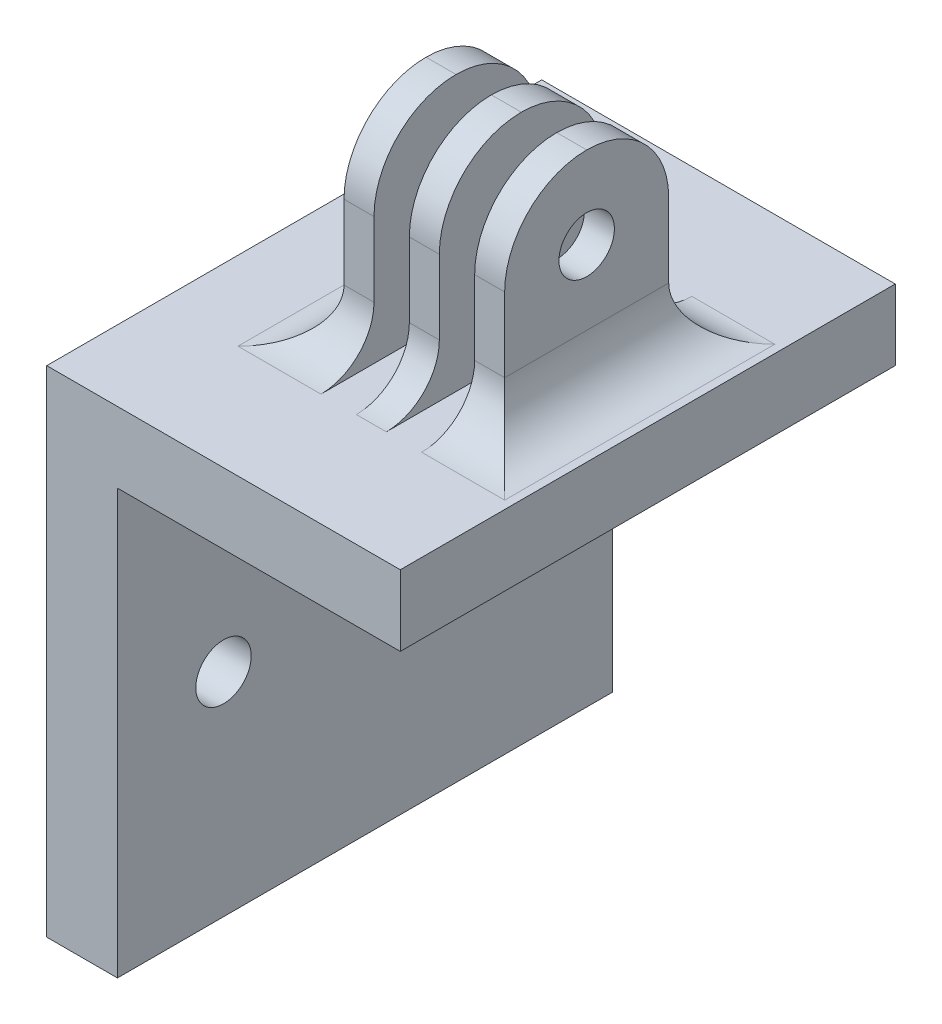
ISO-10303-21;
HEADER;
FILE_DESCRIPTION(('STEP AP214'),'2;1');
FILE_NAME('part.step','',(''),(''),'','','');
FILE_SCHEMA(('AUTOMOTIVE_DESIGN { 1 0 10303 214 1 1 1 1 }'));
ENDSEC;
DATA;
#1=APPLICATION_CONTEXT('core data for automotive mechanical design processes');
#2=APPLICATION_PROTOCOL_DEFINITION('international standard','automotive_design',2000,#1);
#3=PRODUCT_CONTEXT('',#1,'mechanical');
#4=PRODUCT('Part','Part','',(#3));
#5=PRODUCT_RELATED_PRODUCT_CATEGORY('part','',(#4));
#6=PRODUCT_DEFINITION_FORMATION('','',#4);
#7=PRODUCT_DEFINITION_CONTEXT('part definition',#1,'design');
#8=PRODUCT_DEFINITION('design','',#6,#7);
#9=PRODUCT_DEFINITION_SHAPE('','',#8);
#10=(LENGTH_UNIT() NAMED_UNIT(*) SI_UNIT(.MILLI.,.METRE.));
#11=(NAMED_UNIT(*) PLANE_ANGLE_UNIT() SI_UNIT($,.RADIAN.));
#12=(NAMED_UNIT(*) SI_UNIT($,.STERADIAN.) SOLID_ANGLE_UNIT());
#13=UNCERTAINTY_MEASURE_WITH_UNIT(LENGTH_MEASURE(1.E-05),#10,'distance_accuracy_value','');
#14=(GEOMETRIC_REPRESENTATION_CONTEXT(3) GLOBAL_UNCERTAINTY_ASSIGNED_CONTEXT((#13)) GLOBAL_UNIT_ASSIGNED_CONTEXT((#10,
#11,#12)) REPRESENTATION_CONTEXT('',''));
#15=CARTESIAN_POINT('',(0.,0.,0.));
#16=DIRECTION('',(0.,0.,1.));
#17=DIRECTION('',(1.,0.,0.));
#18=AXIS2_PLACEMENT_3D('',#15,#16,#17);
#19=CARTESIAN_POINT('',(6.35,22.225,22.225));
#20=DIRECTION('',(0.,-1.,0.));
#21=DIRECTION('',(0.,0.,-1.));
#22=AXIS2_PLACEMENT_3D('',#19,#20,#21);
#23=PLANE('',#22);
#24=DIRECTION('',(0.,0.,1.));
#25=VECTOR('',#24,1.);
#26=CARTESIAN_POINT('',(17.7038,22.225,7.366));
#27=LINE('',#26,#25);
#28=CARTESIAN_POINT('',(17.7038,22.225,-12.1285));
#29=VERTEX_POINT('',#28);
#30=CARTESIAN_POINT('',(17.7038,22.225,12.1285));
#31=VERTEX_POINT('',#30);
#32=EDGE_CURVE('E431',#29,#31,#27,.T.);
#33=ORIENTED_EDGE('',*,*,#32,.F.);
#34=DIRECTION('',(-1.,0.,0.));
#35=VECTOR('',#34,1.);
#36=CARTESIAN_POINT('',(20.3962,22.225,-12.1285));
#37=LINE('',#36,#35);
#38=CARTESIAN_POINT('',(20.3962,22.225,-12.1285));
#39=VERTEX_POINT('',#38);
#40=EDGE_CURVE('E361',#29,#39,#37,.F.);
#41=ORIENTED_EDGE('',*,*,#40,.T.);
#42=DIRECTION('',(0.,0.,-1.));
#43=VECTOR('',#42,1.);
#44=CARTESIAN_POINT('',(20.3962,22.225,7.366));
#45=LINE('',#44,#43);
#46=CARTESIAN_POINT('',(20.3962,22.225,12.1285));
#47=VERTEX_POINT('',#46);
#48=EDGE_CURVE('E434',#47,#39,#45,.T.);
#49=ORIENTED_EDGE('',*,*,#48,.F.);
#50=DIRECTION('',(1.,0.,0.));
#51=VECTOR('',#50,1.);
#52=CARTESIAN_POINT('',(17.7038,22.225,12.1285));
#53=LINE('',#52,#51);
#54=EDGE_CURVE('E351',#47,#31,#53,.F.);
#55=ORIENTED_EDGE('',*,*,#54,.T.);
#56=EDGE_LOOP('',(#33,#41,#49,#55));
#57=FACE_BOUND('',#56,.T.);
#58=DIRECTION('',(0.,0.,1.));
#59=VECTOR('',#58,1.);
#60=CARTESIAN_POINT('',(0.,22.225,22.225));
#61=LINE('',#60,#59);
#62=CARTESIAN_POINT('',(0.,22.225,-22.225));
#63=VERTEX_POINT('',#62);
#64=CARTESIAN_POINT('',(0.,22.225,22.225));
#65=VERTEX_POINT('',#64);
#66=EDGE_CURVE('E276',#63,#65,#61,.T.);
#67=ORIENTED_EDGE('',*,*,#66,.T.);
#68=DIRECTION('',(-1.,0.,0.));
#69=VECTOR('',#68,1.);
#70=CARTESIAN_POINT('',(6.35,22.225,22.225));
#71=LINE('',#70,#69);
#72=CARTESIAN_POINT('',(31.75,22.225,22.225));
#73=VERTEX_POINT('',#72);
#74=EDGE_CURVE('E286',#73,#65,#71,.T.);
#75=ORIENTED_EDGE('',*,*,#74,.F.);
#76=DIRECTION('',(0.,0.,1.));
#77=VECTOR('',#76,1.);
#78=CARTESIAN_POINT('',(31.75,22.225,22.225));
#79=LINE('',#78,#77);
#80=CARTESIAN_POINT('',(31.75,22.225,-22.225));
#81=VERTEX_POINT('',#80);
#82=EDGE_CURVE('E241',#81,#73,#79,.T.);
#83=ORIENTED_EDGE('',*,*,#82,.F.);
#84=DIRECTION('',(-1.,0.,0.));
#85=VECTOR('',#84,1.);
#86=CARTESIAN_POINT('',(6.35,22.225,-22.225));
#87=LINE('',#86,#85);
#88=EDGE_CURVE('E288',#81,#63,#87,.T.);
#89=ORIENTED_EDGE('',*,*,#88,.T.);
#90=EDGE_LOOP('',(#67,#75,#83,#89));
#91=FACE_BOUND('',#90,.T.);
#92=DIRECTION('',(-1.,0.,0.));
#93=VECTOR('',#92,1.);
#94=CARTESIAN_POINT('',(14.5288,22.225,-12.1285));
#95=LINE('',#94,#93);
#96=CARTESIAN_POINT('',(7.07389999999999,22.225,-12.1285));
#97=VERTEX_POINT('',#96);
#98=CARTESIAN_POINT('',(14.5288,22.225,-12.1285));
#99=VERTEX_POINT('',#98);
#100=EDGE_CURVE('E348',#97,#99,#95,.F.);
#101=ORIENTED_EDGE('',*,*,#100,.T.);
#102=DIRECTION('',(0.,0.,-1.));
#103=VECTOR('',#102,1.);
#104=CARTESIAN_POINT('',(14.5288,22.225,7.366));
#105=LINE('',#104,#103);
#106=CARTESIAN_POINT('',(14.5288,22.225,12.1285));
#107=VERTEX_POINT('',#106);
#108=EDGE_CURVE('E454',#107,#99,#105,.T.);
#109=ORIENTED_EDGE('',*,*,#108,.F.);
#110=DIRECTION('',(1.,0.,0.));
#111=VECTOR('',#110,1.);
#112=CARTESIAN_POINT('',(11.8364,22.225,12.1285));
#113=LINE('',#112,#111);
#114=CARTESIAN_POINT('',(7.07389999999999,22.225,12.1285));
#115=VERTEX_POINT('',#114);
#116=EDGE_CURVE('E344',#107,#115,#113,.F.);
#117=ORIENTED_EDGE('',*,*,#116,.T.);
#118=DIRECTION('',(0.,0.,1.));
#119=VECTOR('',#118,1.);
#120=CARTESIAN_POINT('',(7.07389999999999,22.225,-7.366));
#121=LINE('',#120,#119);
#122=EDGE_CURVE('E346',#115,#97,#121,.F.);
#123=ORIENTED_EDGE('',*,*,#122,.T.);
#124=EDGE_LOOP('',(#101,#109,#117,#123));
#125=FACE_BOUND('',#124,.T.);
#126=DIRECTION('',(0.,0.,1.));
#127=VECTOR('',#126,1.);
#128=CARTESIAN_POINT('',(23.5712,22.225,7.366));
#129=LINE('',#128,#127);
#130=CARTESIAN_POINT('',(23.5712,22.225,-12.1285));
#131=VERTEX_POINT('',#130);
#132=CARTESIAN_POINT('',(23.5712,22.225,12.1285));
#133=VERTEX_POINT('',#132);
#134=EDGE_CURVE('E334',#131,#133,#129,.T.);
#135=ORIENTED_EDGE('',*,*,#134,.F.);
#136=DIRECTION('',(-1.,0.,0.));
#137=VECTOR('',#136,1.);
#138=CARTESIAN_POINT('',(26.2636,22.225,-12.1285));
#139=LINE('',#138,#137);
#140=CARTESIAN_POINT('',(31.0261,22.225,-12.1285));
#141=VERTEX_POINT('',#140);
#142=EDGE_CURVE('E359',#131,#141,#139,.F.);
#143=ORIENTED_EDGE('',*,*,#142,.T.);
#144=DIRECTION('',(0.,0.,-1.));
#145=VECTOR('',#144,1.);
#146=CARTESIAN_POINT('',(31.0261,22.225,7.366));
#147=LINE('',#146,#145);
#148=CARTESIAN_POINT('',(31.0261,22.225,12.1285));
#149=VERTEX_POINT('',#148);
#150=EDGE_CURVE('E357',#141,#149,#147,.F.);
#151=ORIENTED_EDGE('',*,*,#150,.T.);
#152=DIRECTION('',(1.,0.,0.));
#153=VECTOR('',#152,1.);
#154=CARTESIAN_POINT('',(23.5712,22.225,12.1285));
#155=LINE('',#154,#153);
#156=EDGE_CURVE('E354',#149,#133,#155,.F.);
#157=ORIENTED_EDGE('',*,*,#156,.T.);
#158=EDGE_LOOP('',(#135,#143,#151,#157));
#159=FACE_BOUND('',#158,.T.);
#160=ADVANCED_FACE('F39',(#57,#91,#125,#159),#23,.F.);
#161=CARTESIAN_POINT('',(6.35,0.,0.));
#162=DIRECTION('',(-1.,0.,0.));
#163=DIRECTION('',(0.,0.,1.));
#164=AXIS2_PLACEMENT_3D('',#161,#162,#163);
#165=PLANE('',#164);
#166=CARTESIAN_POINT('',(6.35,-3.17499999999999,-12.7));
#167=DIRECTION('',(1.,0.,0.));
#168=DIRECTION('',(0.,0.,-1.));
#169=AXIS2_PLACEMENT_3D('',#166,#167,#168);
#170=CIRCLE('',#169,2.4892);
#171=CARTESIAN_POINT('',(6.35,-3.17499999999999,-15.1892));
#172=VERTEX_POINT('',#171);
#173=EDGE_CURVE('E253',#172,#172,#170,.T.);
#174=ORIENTED_EDGE('',*,*,#173,.F.);
#175=EDGE_LOOP('',(#174));
#176=FACE_BOUND('',#175,.T.);
#177=CARTESIAN_POINT('',(6.35,-3.17499999999999,12.7));
#178=DIRECTION('',(1.,0.,0.));
#179=DIRECTION('',(0.,0.,-1.));
#180=AXIS2_PLACEMENT_3D('',#177,#178,#179);
#181=CIRCLE('',#180,2.4892);
#182=CARTESIAN_POINT('',(6.35,-3.17499999999999,10.2108));
#183=VERTEX_POINT('',#182);
#184=EDGE_CURVE('E261',#183,#183,#181,.T.);
#185=ORIENTED_EDGE('',*,*,#184,.F.);
#186=EDGE_LOOP('',(#185));
#187=FACE_BOUND('',#186,.T.);
#188=DIRECTION('',(0.,0.,-1.));
#189=VECTOR('',#188,1.);
#190=CARTESIAN_POINT('',(6.35,15.875,22.225));
#191=LINE('',#190,#189);
#192=CARTESIAN_POINT('',(6.35,15.875,22.225));
#193=VERTEX_POINT('',#192);
#194=CARTESIAN_POINT('',(6.35,15.875,-22.225));
#195=VERTEX_POINT('',#194);
#196=EDGE_CURVE('E244',#193,#195,#191,.T.);
#197=ORIENTED_EDGE('',*,*,#196,.F.);
#198=DIRECTION('',(0.,-1.,0.));
#199=VECTOR('',#198,1.);
#200=CARTESIAN_POINT('',(6.35,-22.225,22.225));
#201=LINE('',#200,#199);
#202=CARTESIAN_POINT('',(6.35,-22.225,22.225));
#203=VERTEX_POINT('',#202);
#204=EDGE_CURVE('E249',#193,#203,#201,.T.);
#205=ORIENTED_EDGE('',*,*,#204,.T.);
#206=DIRECTION('',(0.,0.,-1.));
#207=VECTOR('',#206,1.);
#208=CARTESIAN_POINT('',(6.35,-22.225,22.225));
#209=LINE('',#208,#207);
#210=CARTESIAN_POINT('',(6.35,-22.225,-22.225));
#211=VERTEX_POINT('',#210);
#212=EDGE_CURVE('E271',#203,#211,#209,.T.);
#213=ORIENTED_EDGE('',*,*,#212,.T.);
#214=DIRECTION('',(0.,1.,0.));
#215=VECTOR('',#214,1.);
#216=CARTESIAN_POINT('',(6.35,-22.225,-22.225));
#217=LINE('',#216,#215);
#218=EDGE_CURVE('E267',#211,#195,#217,.T.);
#219=ORIENTED_EDGE('',*,*,#218,.T.);
#220=EDGE_LOOP('',(#197,#205,#213,#219));
#221=FACE_BOUND('',#220,.T.);
#222=ADVANCED_FACE('F482',(#176,#187,#221),#165,.F.);
#223=CARTESIAN_POINT('',(0.,0.,0.));
#224=DIRECTION('',(-1.,0.,0.));
#225=DIRECTION('',(0.,0.,1.));
#226=AXIS2_PLACEMENT_3D('',#223,#224,#225);
#227=PLANE('',#226);
#228=CARTESIAN_POINT('',(0.,-3.17499999999999,12.7));
#229=DIRECTION('',(1.,0.,0.));
#230=DIRECTION('',(0.,0.,-1.));
#231=AXIS2_PLACEMENT_3D('',#228,#229,#230);
#232=CIRCLE('',#231,2.4892);
#233=CARTESIAN_POINT('',(0.,-3.17499999999999,10.2108));
#234=VERTEX_POINT('',#233);
#235=EDGE_CURVE('E259',#234,#234,#232,.T.);
#236=ORIENTED_EDGE('',*,*,#235,.T.);
#237=EDGE_LOOP('',(#236));
#238=FACE_BOUND('',#237,.T.);
#239=DIRECTION('',(0.,1.,0.));
#240=VECTOR('',#239,1.);
#241=CARTESIAN_POINT('',(0.,-22.225,-22.225));
#242=LINE('',#241,#240);
#243=CARTESIAN_POINT('',(0.,-22.225,-22.225));
#244=VERTEX_POINT('',#243);
#245=EDGE_CURVE('E264',#244,#63,#242,.T.);
#246=ORIENTED_EDGE('',*,*,#245,.F.);
#247=DIRECTION('',(0.,0.,-1.));
#248=VECTOR('',#247,1.);
#249=CARTESIAN_POINT('',(0.,-22.225,22.225));
#250=LINE('',#249,#248);
#251=CARTESIAN_POINT('',(0.,-22.225,22.225));
#252=VERTEX_POINT('',#251);
#253=EDGE_CURVE('E269',#252,#244,#250,.T.);
#254=ORIENTED_EDGE('',*,*,#253,.F.);
#255=DIRECTION('',(0.,-1.,0.));
#256=VECTOR('',#255,1.);
#257=CARTESIAN_POINT('',(0.,-22.225,22.225));
#258=LINE('',#257,#256);
#259=EDGE_CURVE('E278',#65,#252,#258,.T.);
#260=ORIENTED_EDGE('',*,*,#259,.F.);
#261=ORIENTED_EDGE('',*,*,#66,.F.);
#262=EDGE_LOOP('',(#246,#254,#260,#261));
#263=FACE_BOUND('',#262,.T.);
#264=CARTESIAN_POINT('',(0.,-3.17499999999999,-12.7));
#265=DIRECTION('',(1.,0.,0.));
#266=DIRECTION('',(0.,0.,-1.));
#267=AXIS2_PLACEMENT_3D('',#264,#265,#266);
#268=CIRCLE('',#267,2.4892);
#269=CARTESIAN_POINT('',(0.,-3.17499999999999,-15.1892));
#270=VERTEX_POINT('',#269);
#271=EDGE_CURVE('E250',#270,#270,#268,.T.);
#272=ORIENTED_EDGE('',*,*,#271,.T.);
#273=EDGE_LOOP('',(#272));
#274=FACE_BOUND('',#273,.T.);
#275=ADVANCED_FACE('F476',(#238,#263,#274),#227,.T.);
#276=CARTESIAN_POINT('',(6.35,-22.225,-22.225));
#277=DIRECTION('',(0.,0.,1.));
#278=DIRECTION('',(1.,0.,0.));
#279=AXIS2_PLACEMENT_3D('',#276,#277,#278);
#280=PLANE('',#279);
#281=ORIENTED_EDGE('',*,*,#245,.T.);
#282=ORIENTED_EDGE('',*,*,#88,.F.);
#283=DIRECTION('',(0.,1.,0.));
#284=VECTOR('',#283,1.);
#285=CARTESIAN_POINT('',(31.75,22.225,-22.225));
#286=LINE('',#285,#284);
#287=CARTESIAN_POINT('',(31.75,15.875,-22.225));
#288=VERTEX_POINT('',#287);
#289=EDGE_CURVE('E234',#288,#81,#286,.T.);
#290=ORIENTED_EDGE('',*,*,#289,.F.);
#291=DIRECTION('',(-1.,0.,0.));
#292=VECTOR('',#291,1.);
#293=CARTESIAN_POINT('',(31.75,15.875,-22.225));
#294=LINE('',#293,#292);
#295=EDGE_CURVE('E230',#288,#195,#294,.T.);
#296=ORIENTED_EDGE('',*,*,#295,.T.);
#297=ORIENTED_EDGE('',*,*,#218,.F.);
#298=DIRECTION('',(-1.,0.,0.));
#299=VECTOR('',#298,1.);
#300=CARTESIAN_POINT('',(6.35,-22.225,-22.225));
#301=LINE('',#300,#299);
#302=EDGE_CURVE('E273',#211,#244,#301,.T.);
#303=ORIENTED_EDGE('',*,*,#302,.T.);
#304=EDGE_LOOP('',(#281,#282,#290,#296,#297,#303));
#305=FACE_BOUND('',#304,.T.);
#306=ADVANCED_FACE('F469',(#305),#280,.F.);
#307=CARTESIAN_POINT('',(6.35,-22.225,22.225));
#308=DIRECTION('',(0.,0.,-1.));
#309=DIRECTION('',(-1.,0.,0.));
#310=AXIS2_PLACEMENT_3D('',#307,#308,#309);
#311=PLANE('',#310);
#312=ORIENTED_EDGE('',*,*,#259,.T.);
#313=DIRECTION('',(-1.,0.,0.));
#314=VECTOR('',#313,1.);
#315=CARTESIAN_POINT('',(6.35,-22.225,22.225));
#316=LINE('',#315,#314);
#317=EDGE_CURVE('E283',#203,#252,#316,.T.);
#318=ORIENTED_EDGE('',*,*,#317,.F.);
#319=ORIENTED_EDGE('',*,*,#204,.F.);
#320=DIRECTION('',(-1.,0.,0.));
#321=VECTOR('',#320,1.);
#322=CARTESIAN_POINT('',(31.75,15.875,22.225));
#323=LINE('',#322,#321);
#324=CARTESIAN_POINT('',(31.75,15.875,22.225));
#325=VERTEX_POINT('',#324);
#326=EDGE_CURVE('E228',#325,#193,#323,.T.);
#327=ORIENTED_EDGE('',*,*,#326,.F.);
#328=DIRECTION('',(0.,-1.,0.));
#329=VECTOR('',#328,1.);
#330=CARTESIAN_POINT('',(31.75,22.225,22.225));
#331=LINE('',#330,#329);
#332=EDGE_CURVE('E235',#73,#325,#331,.T.);
#333=ORIENTED_EDGE('',*,*,#332,.F.);
#334=ORIENTED_EDGE('',*,*,#74,.T.);
#335=EDGE_LOOP('',(#312,#318,#319,#327,#333,#334));
#336=FACE_BOUND('',#335,.T.);
#337=ADVANCED_FACE('F247',(#336),#311,.F.);
#338=CARTESIAN_POINT('',(6.35,-22.225,22.225));
#339=DIRECTION('',(0.,1.,0.));
#340=DIRECTION('',(0.,0.,1.));
#341=AXIS2_PLACEMENT_3D('',#338,#339,#340);
#342=PLANE('',#341);
#343=ORIENTED_EDGE('',*,*,#253,.T.);
#344=ORIENTED_EDGE('',*,*,#302,.F.);
#345=ORIENTED_EDGE('',*,*,#212,.F.);
#346=ORIENTED_EDGE('',*,*,#317,.T.);
#347=EDGE_LOOP('',(#343,#344,#345,#346));
#348=FACE_BOUND('',#347,.T.);
#349=ADVANCED_FACE('F480',(#348),#342,.F.);
#350=CARTESIAN_POINT('',(6.35,-3.17499999999999,12.7));
#351=DIRECTION('',(-1.,0.,0.));
#352=DIRECTION('',(0.,0.,1.));
#353=AXIS2_PLACEMENT_3D('',#350,#351,#352);
#354=CYLINDRICAL_SURFACE('',#353,2.4892);
#355=ORIENTED_EDGE('',*,*,#184,.T.);
#356=EDGE_LOOP('',(#355));
#357=FACE_BOUND('',#356,.T.);
#358=ORIENTED_EDGE('',*,*,#235,.F.);
#359=EDGE_LOOP('',(#358));
#360=FACE_BOUND('',#359,.T.);
#361=ADVANCED_FACE('F499',(#357,#360),#354,.F.);
#362=CARTESIAN_POINT('',(6.35,-3.17499999999999,-12.7));
#363=DIRECTION('',(-1.,0.,0.));
#364=DIRECTION('',(0.,0.,1.));
#365=AXIS2_PLACEMENT_3D('',#362,#363,#364);
#366=CYLINDRICAL_SURFACE('',#365,2.4892);
#367=ORIENTED_EDGE('',*,*,#173,.T.);
#368=EDGE_LOOP('',(#367));
#369=FACE_BOUND('',#368,.T.);
#370=ORIENTED_EDGE('',*,*,#271,.F.);
#371=EDGE_LOOP('',(#370));
#372=FACE_BOUND('',#371,.T.);
#373=ADVANCED_FACE('F633',(#369,#372),#366,.F.);
#374=CARTESIAN_POINT('',(31.75,15.875,22.225));
#375=DIRECTION('',(0.,1.,0.));
#376=DIRECTION('',(0.,0.,1.));
#377=AXIS2_PLACEMENT_3D('',#374,#375,#376);
#378=PLANE('',#377);
#379=ORIENTED_EDGE('',*,*,#196,.T.);
#380=ORIENTED_EDGE('',*,*,#295,.F.);
#381=DIRECTION('',(0.,0.,-1.));
#382=VECTOR('',#381,1.);
#383=CARTESIAN_POINT('',(31.75,15.875,22.225));
#384=LINE('',#383,#382);
#385=EDGE_CURVE('E223',#325,#288,#384,.T.);
#386=ORIENTED_EDGE('',*,*,#385,.F.);
#387=ORIENTED_EDGE('',*,*,#326,.T.);
#388=EDGE_LOOP('',(#379,#380,#386,#387));
#389=FACE_BOUND('',#388,.T.);
#390=ADVANCED_FACE('F226',(#389),#378,.F.);
#391=CARTESIAN_POINT('',(31.75,0.,0.));
#392=DIRECTION('',(1.,0.,0.));
#393=DIRECTION('',(0.,0.,-1.));
#394=AXIS2_PLACEMENT_3D('',#391,#392,#393);
#395=PLANE('',#394);
#396=ORIENTED_EDGE('',*,*,#332,.T.);
#397=ORIENTED_EDGE('',*,*,#385,.T.);
#398=ORIENTED_EDGE('',*,*,#289,.T.);
#399=ORIENTED_EDGE('',*,*,#82,.T.);
#400=EDGE_LOOP('',(#396,#397,#398,#399));
#401=FACE_BOUND('',#400,.T.);
#402=ADVANCED_FACE('F239',(#401),#395,.T.);
#403=CARTESIAN_POINT('',(14.5288,41.021,7.366));
#404=DIRECTION('',(-1.,0.,0.));
#405=DIRECTION('',(0.,0.,1.));
#406=AXIS2_PLACEMENT_3D('',#403,#404,#405);
#407=PLANE('',#406);
#408=CARTESIAN_POINT('',(14.5288,33.655,0.));
#409=DIRECTION('',(-1.,0.,0.));
#410=DIRECTION('',(0.,0.,1.));
#411=AXIS2_PLACEMENT_3D('',#408,#409,#410);
#412=CIRCLE('',#411,2.4892);
#413=CARTESIAN_POINT('',(14.5288,33.655,2.4892));
#414=VERTEX_POINT('',#413);
#415=EDGE_CURVE('E341',#414,#414,#412,.T.);
#416=ORIENTED_EDGE('',*,*,#415,.T.);
#417=EDGE_LOOP('',(#416));
#418=FACE_BOUND('',#417,.T.);
#419=DIRECTION('',(0.,-1.,0.));
#420=VECTOR('',#419,1.);
#421=CARTESIAN_POINT('',(14.5288,41.021,-7.366));
#422=LINE('',#421,#420);
#423=CARTESIAN_POINT('',(14.5288,33.655,-7.366));
#424=VERTEX_POINT('',#423);
#425=CARTESIAN_POINT('',(14.5288,26.9875,-7.366));
#426=VERTEX_POINT('',#425);
#427=EDGE_CURVE('E462',#424,#426,#422,.T.);
#428=ORIENTED_EDGE('',*,*,#427,.F.);
#429=CARTESIAN_POINT('',(14.5288,33.655,0.));
#430=DIRECTION('',(-1.,0.,0.));
#431=DIRECTION('',(0.,0.,1.));
#432=AXIS2_PLACEMENT_3D('',#429,#430,#431);
#433=CIRCLE('',#432,7.366);
#434=CARTESIAN_POINT('',(14.5288,41.021,0.));
#435=VERTEX_POINT('',#434);
#436=EDGE_CURVE('E322',#424,#435,#433,.F.);
#437=ORIENTED_EDGE('',*,*,#436,.T.);
#438=CARTESIAN_POINT('',(14.5288,33.655,0.));
#439=DIRECTION('',(-1.,0.,0.));
#440=DIRECTION('',(0.,0.,1.));
#441=AXIS2_PLACEMENT_3D('',#438,#439,#440);
#442=CIRCLE('',#441,7.366);
#443=CARTESIAN_POINT('',(14.5288,33.655,7.366));
#444=VERTEX_POINT('',#443);
#445=EDGE_CURVE('E320',#435,#444,#442,.F.);
#446=ORIENTED_EDGE('',*,*,#445,.T.);
#447=DIRECTION('',(0.,-1.,0.));
#448=VECTOR('',#447,1.);
#449=CARTESIAN_POINT('',(14.5288,41.021,7.366));
#450=LINE('',#449,#448);
#451=CARTESIAN_POINT('',(14.5288,26.9875,7.366));
#452=VERTEX_POINT('',#451);
#453=EDGE_CURVE('E456',#444,#452,#450,.T.);
#454=ORIENTED_EDGE('',*,*,#453,.T.);
#455=CARTESIAN_POINT('',(14.5288,26.9875,12.1285));
#456=DIRECTION('',(-1.,0.,0.));
#457=DIRECTION('',(0.,0.,1.));
#458=AXIS2_PLACEMENT_3D('',#455,#456,#457);
#459=CIRCLE('',#458,4.7625);
#460=EDGE_CURVE('E11',#452,#107,#459,.T.);
#461=ORIENTED_EDGE('',*,*,#460,.T.);
#462=ORIENTED_EDGE('',*,*,#108,.T.);
#463=CARTESIAN_POINT('',(14.5288,26.9875,-12.1285));
#464=DIRECTION('',(-1.,0.,0.));
#465=DIRECTION('',(0.,0.,1.));
#466=AXIS2_PLACEMENT_3D('',#463,#464,#465);
#467=CIRCLE('',#466,4.7625);
#468=EDGE_CURVE('E379',#99,#426,#467,.T.);
#469=ORIENTED_EDGE('',*,*,#468,.T.);
#470=EDGE_LOOP('',(#428,#437,#446,#454,#461,#462,#469));
#471=FACE_BOUND('',#470,.T.);
#472=ADVANCED_FACE('F625',(#418,#471),#407,.F.);
#473=CARTESIAN_POINT('',(11.8364,41.021,-7.366));
#474=DIRECTION('',(0.,0.,1.));
#475=DIRECTION('',(1.,0.,0.));
#476=AXIS2_PLACEMENT_3D('',#473,#474,#475);
#477=PLANE('',#476);
#478=ORIENTED_EDGE('',*,*,#427,.T.);
#479=DIRECTION('',(-1.,0.,0.));
#480=VECTOR('',#479,1.);
#481=CARTESIAN_POINT('',(11.8364,26.9875,-7.366));
#482=LINE('',#481,#480);
#483=CARTESIAN_POINT('',(11.8364,26.9875,-7.366));
#484=VERTEX_POINT('',#483);
#485=EDGE_CURVE('E330',#426,#484,#482,.T.);
#486=ORIENTED_EDGE('',*,*,#485,.T.);
#487=DIRECTION('',(0.,-1.,0.));
#488=VECTOR('',#487,1.);
#489=CARTESIAN_POINT('',(11.8364,41.021,-7.366));
#490=LINE('',#489,#488);
#491=CARTESIAN_POINT('',(11.8364,33.655,-7.366));
#492=VERTEX_POINT('',#491);
#493=EDGE_CURVE('E460',#492,#484,#490,.T.);
#494=ORIENTED_EDGE('',*,*,#493,.F.);
#495=DIRECTION('',(-1.,0.,0.));
#496=VECTOR('',#495,1.);
#497=CARTESIAN_POINT('',(11.8364,33.655,-7.366));
#498=LINE('',#497,#496);
#499=EDGE_CURVE('E317',#492,#424,#498,.F.);
#500=ORIENTED_EDGE('',*,*,#499,.T.);
#501=EDGE_LOOP('',(#478,#486,#494,#500));
#502=FACE_BOUND('',#501,.T.);
#503=ADVANCED_FACE('F621',(#502),#477,.F.);
#504=CARTESIAN_POINT('',(11.8364,41.021,7.366));
#505=DIRECTION('',(1.,0.,0.));
#506=DIRECTION('',(0.,0.,-1.));
#507=AXIS2_PLACEMENT_3D('',#504,#505,#506);
#508=PLANE('',#507);
#509=CARTESIAN_POINT('',(11.8364,33.655,0.));
#510=DIRECTION('',(-1.,0.,0.));
#511=DIRECTION('',(0.,0.,1.));
#512=AXIS2_PLACEMENT_3D('',#509,#510,#511);
#513=CIRCLE('',#512,2.4892);
#514=CARTESIAN_POINT('',(11.8364,33.655,2.4892));
#515=VERTEX_POINT('',#514);
#516=EDGE_CURVE('E399',#515,#515,#513,.T.);
#517=ORIENTED_EDGE('',*,*,#516,.F.);
#518=EDGE_LOOP('',(#517));
#519=FACE_BOUND('',#518,.T.);
#520=ORIENTED_EDGE('',*,*,#493,.T.);
#521=DIRECTION('',(0.,0.,1.));
#522=VECTOR('',#521,1.);
#523=CARTESIAN_POINT('',(11.8364,26.9875,7.366));
#524=LINE('',#523,#522);
#525=CARTESIAN_POINT('',(11.8364,26.9875,7.366));
#526=VERTEX_POINT('',#525);
#527=EDGE_CURVE('E64',#484,#526,#524,.T.);
#528=ORIENTED_EDGE('',*,*,#527,.T.);
#529=DIRECTION('',(0.,-1.,0.));
#530=VECTOR('',#529,1.);
#531=CARTESIAN_POINT('',(11.8364,41.021,7.366));
#532=LINE('',#531,#530);
#533=CARTESIAN_POINT('',(11.8364,33.655,7.366));
#534=VERTEX_POINT('',#533);
#535=EDGE_CURVE('E458',#534,#526,#532,.T.);
#536=ORIENTED_EDGE('',*,*,#535,.F.);
#537=CARTESIAN_POINT('',(11.8364,33.655,0.));
#538=DIRECTION('',(1.,0.,0.));
#539=DIRECTION('',(0.,0.,-1.));
#540=AXIS2_PLACEMENT_3D('',#537,#538,#539);
#541=CIRCLE('',#540,7.366);
#542=CARTESIAN_POINT('',(11.8364,41.021,0.));
#543=VERTEX_POINT('',#542);
#544=EDGE_CURVE('E313',#534,#543,#541,.F.);
#545=ORIENTED_EDGE('',*,*,#544,.T.);
#546=CARTESIAN_POINT('',(11.8364,33.655,0.));
#547=DIRECTION('',(1.,0.,0.));
#548=DIRECTION('',(0.,0.,-1.));
#549=AXIS2_PLACEMENT_3D('',#546,#547,#548);
#550=CIRCLE('',#549,7.366);
#551=EDGE_CURVE('E315',#543,#492,#550,.F.);
#552=ORIENTED_EDGE('',*,*,#551,.T.);
#553=EDGE_LOOP('',(#520,#528,#536,#545,#552));
#554=FACE_BOUND('',#553,.T.);
#555=ADVANCED_FACE('F618',(#519,#554),#508,.F.);
#556=CARTESIAN_POINT('',(11.8364,41.021,7.366));
#557=DIRECTION('',(0.,0.,-1.));
#558=DIRECTION('',(-1.,0.,0.));
#559=AXIS2_PLACEMENT_3D('',#556,#557,#558);
#560=PLANE('',#559);
#561=ORIENTED_EDGE('',*,*,#535,.T.);
#562=DIRECTION('',(1.,0.,0.));
#563=VECTOR('',#562,1.);
#564=CARTESIAN_POINT('',(14.5288,26.9875,7.366));
#565=LINE('',#564,#563);
#566=EDGE_CURVE('E56',#526,#452,#565,.T.);
#567=ORIENTED_EDGE('',*,*,#566,.T.);
#568=ORIENTED_EDGE('',*,*,#453,.F.);
#569=DIRECTION('',(1.,0.,0.));
#570=VECTOR('',#569,1.);
#571=CARTESIAN_POINT('',(11.8364,33.655,7.366));
#572=LINE('',#571,#570);
#573=EDGE_CURVE('E328',#444,#534,#572,.F.);
#574=ORIENTED_EDGE('',*,*,#573,.T.);
#575=EDGE_LOOP('',(#561,#567,#568,#574));
#576=FACE_BOUND('',#575,.T.);
#577=ADVANCED_FACE('F615',(#576),#560,.F.);
#578=CARTESIAN_POINT('',(17.7038,41.021,-7.366));
#579=DIRECTION('',(0.,0.,1.));
#580=DIRECTION('',(1.,0.,0.));
#581=AXIS2_PLACEMENT_3D('',#578,#579,#580);
#582=PLANE('',#581);
#583=DIRECTION('',(0.,-1.,0.));
#584=VECTOR('',#583,1.);
#585=CARTESIAN_POINT('',(20.3962,41.021,-7.366));
#586=LINE('',#585,#584);
#587=CARTESIAN_POINT('',(20.3962,33.655,-7.366));
#588=VERTEX_POINT('',#587);
#589=CARTESIAN_POINT('',(20.3962,26.9875,-7.366));
#590=VERTEX_POINT('',#589);
#591=EDGE_CURVE('E442',#588,#590,#586,.T.);
#592=ORIENTED_EDGE('',*,*,#591,.T.);
#593=DIRECTION('',(-1.,0.,0.));
#594=VECTOR('',#593,1.);
#595=CARTESIAN_POINT('',(17.7038,26.9875,-7.366));
#596=LINE('',#595,#594);
#597=CARTESIAN_POINT('',(17.7038,26.9875,-7.366));
#598=VERTEX_POINT('',#597);
#599=EDGE_CURVE('E364',#590,#598,#596,.T.);
#600=ORIENTED_EDGE('',*,*,#599,.T.);
#601=DIRECTION('',(0.,-1.,0.));
#602=VECTOR('',#601,1.);
#603=CARTESIAN_POINT('',(17.7038,41.021,-7.366));
#604=LINE('',#603,#602);
#605=CARTESIAN_POINT('',(17.7038,33.655,-7.366));
#606=VERTEX_POINT('',#605);
#607=EDGE_CURVE('E451',#606,#598,#604,.T.);
#608=ORIENTED_EDGE('',*,*,#607,.F.);
#609=DIRECTION('',(-1.,0.,0.));
#610=VECTOR('',#609,1.);
#611=CARTESIAN_POINT('',(20.3962,33.655,-7.366));
#612=LINE('',#611,#610);
#613=EDGE_CURVE('E306',#606,#588,#612,.F.);
#614=ORIENTED_EDGE('',*,*,#613,.T.);
#615=EDGE_LOOP('',(#592,#600,#608,#614));
#616=FACE_BOUND('',#615,.T.);
#617=ADVANCED_FACE('F591',(#616),#582,.F.);
#618=CARTESIAN_POINT('',(17.7038,41.021,7.366));
#619=DIRECTION('',(1.,0.,0.));
#620=DIRECTION('',(0.,0.,-1.));
#621=AXIS2_PLACEMENT_3D('',#618,#619,#620);
#622=PLANE('',#621);
#623=CARTESIAN_POINT('',(17.7038,33.655,0.));
#624=DIRECTION('',(1.,0.,0.));
#625=DIRECTION('',(0.,0.,-1.));
#626=AXIS2_PLACEMENT_3D('',#623,#624,#625);
#627=CIRCLE('',#626,2.4892);
#628=CARTESIAN_POINT('',(17.7038,33.655,-2.4892));
#629=VERTEX_POINT('',#628);
#630=EDGE_CURVE('E802',#629,#629,#627,.T.);
#631=ORIENTED_EDGE('',*,*,#630,.T.);
#632=EDGE_LOOP('',(#631));
#633=FACE_BOUND('',#632,.T.);
#634=CARTESIAN_POINT('',(17.7038,33.655,0.));
#635=DIRECTION('',(1.,0.,0.));
#636=DIRECTION('',(0.,0.,-1.));
#637=AXIS2_PLACEMENT_3D('',#634,#635,#636);
#638=CIRCLE('',#637,7.366);
#639=CARTESIAN_POINT('',(17.7038,33.655,7.366));
#640=VERTEX_POINT('',#639);
#641=CARTESIAN_POINT('',(17.7038,41.021,0.));
#642=VERTEX_POINT('',#641);
#643=EDGE_CURVE('E302',#640,#642,#638,.F.);
#644=ORIENTED_EDGE('',*,*,#643,.T.);
#645=CARTESIAN_POINT('',(17.7038,33.655,0.));
#646=DIRECTION('',(1.,0.,0.));
#647=DIRECTION('',(0.,0.,-1.));
#648=AXIS2_PLACEMENT_3D('',#645,#646,#647);
#649=CIRCLE('',#648,7.366);
#650=EDGE_CURVE('E304',#642,#606,#649,.F.);
#651=ORIENTED_EDGE('',*,*,#650,.T.);
#652=ORIENTED_EDGE('',*,*,#607,.T.);
#653=CARTESIAN_POINT('',(17.7038,26.9875,-12.1285));
#654=DIRECTION('',(1.,0.,0.));
#655=DIRECTION('',(0.,0.,-1.));
#656=AXIS2_PLACEMENT_3D('',#653,#654,#655);
#657=CIRCLE('',#656,4.7625);
#658=EDGE_CURVE('E381',#598,#29,#657,.T.);
#659=ORIENTED_EDGE('',*,*,#658,.T.);
#660=ORIENTED_EDGE('',*,*,#32,.T.);
#661=CARTESIAN_POINT('',(17.7038,26.9875,12.1285));
#662=DIRECTION('',(1.,0.,0.));
#663=DIRECTION('',(0.,0.,-1.));
#664=AXIS2_PLACEMENT_3D('',#661,#662,#663);
#665=CIRCLE('',#664,4.7625);
#666=CARTESIAN_POINT('',(17.7038,26.9875,7.366));
#667=VERTEX_POINT('',#666);
#668=EDGE_CURVE('E48',#31,#667,#665,.T.);
#669=ORIENTED_EDGE('',*,*,#668,.T.);
#670=DIRECTION('',(0.,-1.,0.));
#671=VECTOR('',#670,1.);
#672=CARTESIAN_POINT('',(17.7038,41.021,7.366));
#673=LINE('',#672,#671);
#674=EDGE_CURVE('E448',#640,#667,#673,.T.);
#675=ORIENTED_EDGE('',*,*,#674,.F.);
#676=EDGE_LOOP('',(#644,#651,#652,#659,#660,#669,#675));
#677=FACE_BOUND('',#676,.T.);
#678=ADVANCED_FACE('F579',(#633,#677),#622,.F.);
#679=CARTESIAN_POINT('',(17.7038,41.021,7.366));
#680=DIRECTION('',(0.,0.,-1.));
#681=DIRECTION('',(-1.,0.,0.));
#682=AXIS2_PLACEMENT_3D('',#679,#680,#681);
#683=PLANE('',#682);
#684=ORIENTED_EDGE('',*,*,#674,.T.);
#685=DIRECTION('',(1.,0.,0.));
#686=VECTOR('',#685,1.);
#687=CARTESIAN_POINT('',(20.3962,26.9875,7.366));
#688=LINE('',#687,#686);
#689=CARTESIAN_POINT('',(20.3962,26.9875,7.366));
#690=VERTEX_POINT('',#689);
#691=EDGE_CURVE('E374',#667,#690,#688,.T.);
#692=ORIENTED_EDGE('',*,*,#691,.T.);
#693=DIRECTION('',(0.,-1.,0.));
#694=VECTOR('',#693,1.);
#695=CARTESIAN_POINT('',(20.3962,41.021,7.366));
#696=LINE('',#695,#694);
#697=CARTESIAN_POINT('',(20.3962,33.655,7.366));
#698=VERTEX_POINT('',#697);
#699=EDGE_CURVE('E445',#698,#690,#696,.T.);
#700=ORIENTED_EDGE('',*,*,#699,.F.);
#701=DIRECTION('',(1.,0.,0.));
#702=VECTOR('',#701,1.);
#703=CARTESIAN_POINT('',(17.7038,33.655,7.366));
#704=LINE('',#703,#702);
#705=EDGE_CURVE('E326',#698,#640,#704,.F.);
#706=ORIENTED_EDGE('',*,*,#705,.T.);
#707=EDGE_LOOP('',(#684,#692,#700,#706));
#708=FACE_BOUND('',#707,.T.);
#709=ADVANCED_FACE('F582',(#708),#683,.F.);
#710=CARTESIAN_POINT('',(20.3962,41.021,7.366));
#711=DIRECTION('',(-1.,0.,0.));
#712=DIRECTION('',(0.,0.,1.));
#713=AXIS2_PLACEMENT_3D('',#710,#711,#712);
#714=PLANE('',#713);
#715=CARTESIAN_POINT('',(20.3962,33.655,0.));
#716=DIRECTION('',(-1.,0.,0.));
#717=DIRECTION('',(0.,0.,1.));
#718=AXIS2_PLACEMENT_3D('',#715,#716,#717);
#719=CIRCLE('',#718,2.4892);
#720=CARTESIAN_POINT('',(20.3962,33.655,2.4892));
#721=VERTEX_POINT('',#720);
#722=EDGE_CURVE('E805',#721,#721,#719,.T.);
#723=ORIENTED_EDGE('',*,*,#722,.T.);
#724=EDGE_LOOP('',(#723));
#725=FACE_BOUND('',#724,.T.);
#726=ORIENTED_EDGE('',*,*,#591,.F.);
#727=CARTESIAN_POINT('',(20.3962,33.655,0.));
#728=DIRECTION('',(-1.,0.,0.));
#729=DIRECTION('',(0.,0.,1.));
#730=AXIS2_PLACEMENT_3D('',#727,#728,#729);
#731=CIRCLE('',#730,7.366);
#732=CARTESIAN_POINT('',(20.3962,41.021,0.));
#733=VERTEX_POINT('',#732);
#734=EDGE_CURVE('E311',#588,#733,#731,.F.);
#735=ORIENTED_EDGE('',*,*,#734,.T.);
#736=CARTESIAN_POINT('',(20.3962,33.655,0.));
#737=DIRECTION('',(-1.,0.,0.));
#738=DIRECTION('',(0.,0.,1.));
#739=AXIS2_PLACEMENT_3D('',#736,#737,#738);
#740=CIRCLE('',#739,7.366);
#741=EDGE_CURVE('E309',#733,#698,#740,.F.);
#742=ORIENTED_EDGE('',*,*,#741,.T.);
#743=ORIENTED_EDGE('',*,*,#699,.T.);
#744=CARTESIAN_POINT('',(20.3962,26.9875,12.1285));
#745=DIRECTION('',(-1.,0.,0.));
#746=DIRECTION('',(0.,0.,1.));
#747=AXIS2_PLACEMENT_3D('',#744,#745,#746);
#748=CIRCLE('',#747,4.7625);
#749=EDGE_CURVE('E391',#690,#47,#748,.T.);
#750=ORIENTED_EDGE('',*,*,#749,.T.);
#751=ORIENTED_EDGE('',*,*,#48,.T.);
#752=CARTESIAN_POINT('',(20.3962,26.9875,-12.1285));
#753=DIRECTION('',(-1.,0.,0.));
#754=DIRECTION('',(0.,0.,1.));
#755=AXIS2_PLACEMENT_3D('',#752,#753,#754);
#756=CIRCLE('',#755,4.7625);
#757=EDGE_CURVE('E384',#39,#590,#756,.T.);
#758=ORIENTED_EDGE('',*,*,#757,.T.);
#759=EDGE_LOOP('',(#726,#735,#742,#743,#750,#751,#758));
#760=FACE_BOUND('',#759,.T.);
#761=ADVANCED_FACE('F595',(#725,#760),#714,.F.);
#762=CARTESIAN_POINT('',(23.5712,41.021,-7.366));
#763=DIRECTION('',(0.,0.,1.));
#764=DIRECTION('',(1.,0.,0.));
#765=AXIS2_PLACEMENT_3D('',#762,#763,#764);
#766=PLANE('',#765);
#767=DIRECTION('',(0.,-1.,0.));
#768=VECTOR('',#767,1.);
#769=CARTESIAN_POINT('',(26.2636,41.021,-7.366));
#770=LINE('',#769,#768);
#771=CARTESIAN_POINT('',(26.2636,33.655,-7.366));
#772=VERTEX_POINT('',#771);
#773=CARTESIAN_POINT('',(26.2636,26.9875,-7.366));
#774=VERTEX_POINT('',#773);
#775=EDGE_CURVE('E428',#772,#774,#770,.T.);
#776=ORIENTED_EDGE('',*,*,#775,.T.);
#777=DIRECTION('',(-1.,0.,0.));
#778=VECTOR('',#777,1.);
#779=CARTESIAN_POINT('',(23.5712,26.9875,-7.366));
#780=LINE('',#779,#778);
#781=CARTESIAN_POINT('',(23.5712,26.9875,-7.366));
#782=VERTEX_POINT('',#781);
#783=EDGE_CURVE('E367',#774,#782,#780,.T.);
#784=ORIENTED_EDGE('',*,*,#783,.T.);
#785=DIRECTION('',(0.,-1.,0.));
#786=VECTOR('',#785,1.);
#787=CARTESIAN_POINT('',(23.5712,41.021,-7.366));
#788=LINE('',#787,#786);
#789=CARTESIAN_POINT('',(23.5712,33.655,-7.366));
#790=VERTEX_POINT('',#789);
#791=EDGE_CURVE('E425',#790,#782,#788,.T.);
#792=ORIENTED_EDGE('',*,*,#791,.F.);
#793=DIRECTION('',(-1.,0.,0.));
#794=VECTOR('',#793,1.);
#795=CARTESIAN_POINT('',(26.2636,33.655,-7.366));
#796=LINE('',#795,#794);
#797=EDGE_CURVE('E295',#790,#772,#796,.F.);
#798=ORIENTED_EDGE('',*,*,#797,.T.);
#799=EDGE_LOOP('',(#776,#784,#792,#798));
#800=FACE_BOUND('',#799,.T.);
#801=ADVANCED_FACE('F424',(#800),#766,.F.);
#802=CARTESIAN_POINT('',(23.5712,41.021,7.366));
#803=DIRECTION('',(1.,0.,0.));
#804=DIRECTION('',(0.,0.,-1.));
#805=AXIS2_PLACEMENT_3D('',#802,#803,#804);
#806=PLANE('',#805);
#807=CARTESIAN_POINT('',(23.5712,33.655,0.));
#808=DIRECTION('',(1.,0.,0.));
#809=DIRECTION('',(0.,0.,-1.));
#810=AXIS2_PLACEMENT_3D('',#807,#808,#809);
#811=CIRCLE('',#810,2.4892);
#812=CARTESIAN_POINT('',(23.5712,33.655,-2.4892));
#813=VERTEX_POINT('',#812);
#814=EDGE_CURVE('E819',#813,#813,#811,.T.);
#815=ORIENTED_EDGE('',*,*,#814,.T.);
#816=EDGE_LOOP('',(#815));
#817=FACE_BOUND('',#816,.T.);
#818=CARTESIAN_POINT('',(23.5712,33.655,0.));
#819=DIRECTION('',(1.,0.,0.));
#820=DIRECTION('',(0.,0.,-1.));
#821=AXIS2_PLACEMENT_3D('',#818,#819,#820);
#822=CIRCLE('',#821,7.366);
#823=CARTESIAN_POINT('',(23.5712,33.655,7.366));
#824=VERTEX_POINT('',#823);
#825=CARTESIAN_POINT('',(23.5712,41.021,0.));
#826=VERTEX_POINT('',#825);
#827=EDGE_CURVE('E291',#824,#826,#822,.F.);
#828=ORIENTED_EDGE('',*,*,#827,.T.);
#829=CARTESIAN_POINT('',(23.5712,33.655,0.));
#830=DIRECTION('',(1.,0.,0.));
#831=DIRECTION('',(0.,0.,-1.));
#832=AXIS2_PLACEMENT_3D('',#829,#830,#831);
#833=CIRCLE('',#832,7.366);
#834=EDGE_CURVE('E293',#826,#790,#833,.F.);
#835=ORIENTED_EDGE('',*,*,#834,.T.);
#836=ORIENTED_EDGE('',*,*,#791,.T.);
#837=CARTESIAN_POINT('',(23.5712,26.9875,-12.1285));
#838=DIRECTION('',(1.,0.,0.));
#839=DIRECTION('',(0.,0.,-1.));
#840=AXIS2_PLACEMENT_3D('',#837,#838,#839);
#841=CIRCLE('',#840,4.7625);
#842=EDGE_CURVE('E386',#782,#131,#841,.T.);
#843=ORIENTED_EDGE('',*,*,#842,.T.);
#844=ORIENTED_EDGE('',*,*,#134,.T.);
#845=CARTESIAN_POINT('',(23.5712,26.9875,12.1285));
#846=DIRECTION('',(1.,0.,0.));
#847=DIRECTION('',(0.,0.,-1.));
#848=AXIS2_PLACEMENT_3D('',#845,#846,#847);
#849=CIRCLE('',#848,4.7625);
#850=CARTESIAN_POINT('',(23.5712,26.9875,7.366));
#851=VERTEX_POINT('',#850);
#852=EDGE_CURVE('E389',#133,#851,#849,.T.);
#853=ORIENTED_EDGE('',*,*,#852,.T.);
#854=DIRECTION('',(0.,-1.,0.));
#855=VECTOR('',#854,1.);
#856=CARTESIAN_POINT('',(23.5712,41.021,7.366));
#857=LINE('',#856,#855);
#858=EDGE_CURVE('E432',#824,#851,#857,.T.);
#859=ORIENTED_EDGE('',*,*,#858,.F.);
#860=EDGE_LOOP('',(#828,#835,#836,#843,#844,#853,#859));
#861=FACE_BOUND('',#860,.T.);
#862=ADVANCED_FACE('F429',(#817,#861),#806,.F.);
#863=CARTESIAN_POINT('',(23.5712,41.021,7.366));
#864=DIRECTION('',(0.,0.,-1.));
#865=DIRECTION('',(-1.,0.,0.));
#866=AXIS2_PLACEMENT_3D('',#863,#864,#865);
#867=PLANE('',#866);
#868=ORIENTED_EDGE('',*,*,#858,.T.);
#869=DIRECTION('',(1.,0.,0.));
#870=VECTOR('',#869,1.);
#871=CARTESIAN_POINT('',(26.2636,26.9875,7.366));
#872=LINE('',#871,#870);
#873=CARTESIAN_POINT('',(26.2636,26.9875,7.366));
#874=VERTEX_POINT('',#873);
#875=EDGE_CURVE('E372',#851,#874,#872,.T.);
#876=ORIENTED_EDGE('',*,*,#875,.T.);
#877=DIRECTION('',(0.,-1.,0.));
#878=VECTOR('',#877,1.);
#879=CARTESIAN_POINT('',(26.2636,41.021,7.366));
#880=LINE('',#879,#878);
#881=CARTESIAN_POINT('',(26.2636,33.655,7.366));
#882=VERTEX_POINT('',#881);
#883=EDGE_CURVE('E437',#882,#874,#880,.T.);
#884=ORIENTED_EDGE('',*,*,#883,.F.);
#885=DIRECTION('',(1.,0.,0.));
#886=VECTOR('',#885,1.);
#887=CARTESIAN_POINT('',(23.5712,33.655,7.366));
#888=LINE('',#887,#886);
#889=EDGE_CURVE('E324',#882,#824,#888,.F.);
#890=ORIENTED_EDGE('',*,*,#889,.T.);
#891=EDGE_LOOP('',(#868,#876,#884,#890));
#892=FACE_BOUND('',#891,.T.);
#893=ADVANCED_FACE('F724',(#892),#867,.F.);
#894=CARTESIAN_POINT('',(26.2636,41.021,7.366));
#895=DIRECTION('',(-1.,0.,0.));
#896=DIRECTION('',(0.,0.,1.));
#897=AXIS2_PLACEMENT_3D('',#894,#895,#896);
#898=PLANE('',#897);
#899=CARTESIAN_POINT('',(26.2636,33.655,0.));
#900=DIRECTION('',(-1.,0.,0.));
#901=DIRECTION('',(0.,0.,1.));
#902=AXIS2_PLACEMENT_3D('',#899,#900,#901);
#903=CIRCLE('',#902,2.4892);
#904=CARTESIAN_POINT('',(26.2636,33.655,2.4892));
#905=VERTEX_POINT('',#904);
#906=EDGE_CURVE('E822',#905,#905,#903,.F.);
#907=ORIENTED_EDGE('',*,*,#906,.F.);
#908=EDGE_LOOP('',(#907));
#909=FACE_BOUND('',#908,.T.);
#910=ORIENTED_EDGE('',*,*,#883,.T.);
#911=DIRECTION('',(0.,0.,-1.));
#912=VECTOR('',#911,1.);
#913=CARTESIAN_POINT('',(26.2636,26.9875,-7.366));
#914=LINE('',#913,#912);
#915=EDGE_CURVE('E370',#874,#774,#914,.T.);
#916=ORIENTED_EDGE('',*,*,#915,.T.);
#917=ORIENTED_EDGE('',*,*,#775,.F.);
#918=CARTESIAN_POINT('',(26.2636,33.655,0.));
#919=DIRECTION('',(-1.,0.,0.));
#920=DIRECTION('',(0.,0.,1.));
#921=AXIS2_PLACEMENT_3D('',#918,#919,#920);
#922=CIRCLE('',#921,7.366);
#923=CARTESIAN_POINT('',(26.2636,41.021,0.));
#924=VERTEX_POINT('',#923);
#925=EDGE_CURVE('E300',#772,#924,#922,.F.);
#926=ORIENTED_EDGE('',*,*,#925,.T.);
#927=CARTESIAN_POINT('',(26.2636,33.655,0.));
#928=DIRECTION('',(-1.,0.,0.));
#929=DIRECTION('',(0.,0.,1.));
#930=AXIS2_PLACEMENT_3D('',#927,#928,#929);
#931=CIRCLE('',#930,7.366);
#932=EDGE_CURVE('E298',#924,#882,#931,.F.);
#933=ORIENTED_EDGE('',*,*,#932,.T.);
#934=EDGE_LOOP('',(#910,#916,#917,#926,#933));
#935=FACE_BOUND('',#934,.T.);
#936=ADVANCED_FACE('F515',(#909,#935),#898,.F.);
#937=CARTESIAN_POINT('',(0.,33.655,0.));
#938=DIRECTION('',(-1.,0.,0.));
#939=DIRECTION('',(0.,0.,1.));
#940=AXIS2_PLACEMENT_3D('',#937,#938,#939);
#941=CYLINDRICAL_SURFACE('',#940,7.366);
#942=ORIENTED_EDGE('',*,*,#889,.F.);
#943=ORIENTED_EDGE('',*,*,#932,.F.);
#944=DIRECTION('',(1.,0.,0.));
#945=VECTOR('',#944,1.);
#946=CARTESIAN_POINT('',(26.2636,41.021,0.));
#947=LINE('',#946,#945);
#948=EDGE_CURVE('E331',#826,#924,#947,.T.);
#949=ORIENTED_EDGE('',*,*,#948,.F.);
#950=ORIENTED_EDGE('',*,*,#827,.F.);
#951=EDGE_LOOP('',(#942,#943,#949,#950));
#952=FACE_BOUND('',#951,.T.);
#953=ADVANCED_FACE('F511',(#952),#941,.T.);
#954=CARTESIAN_POINT('',(0.,33.655,0.));
#955=DIRECTION('',(1.,0.,0.));
#956=DIRECTION('',(0.,0.,-1.));
#957=AXIS2_PLACEMENT_3D('',#954,#955,#956);
#958=CYLINDRICAL_SURFACE('',#957,7.366);
#959=ORIENTED_EDGE('',*,*,#925,.F.);
#960=ORIENTED_EDGE('',*,*,#797,.F.);
#961=ORIENTED_EDGE('',*,*,#834,.F.);
#962=ORIENTED_EDGE('',*,*,#948,.T.);
#963=EDGE_LOOP('',(#959,#960,#961,#962));
#964=FACE_BOUND('',#963,.T.);
#965=ADVANCED_FACE('F507',(#964),#958,.T.);
#966=CARTESIAN_POINT('',(0.,33.655,0.));
#967=DIRECTION('',(-1.,0.,0.));
#968=DIRECTION('',(0.,0.,1.));
#969=AXIS2_PLACEMENT_3D('',#966,#967,#968);
#970=CYLINDRICAL_SURFACE('',#969,7.366);
#971=ORIENTED_EDGE('',*,*,#705,.F.);
#972=ORIENTED_EDGE('',*,*,#741,.F.);
#973=DIRECTION('',(1.,0.,0.));
#974=VECTOR('',#973,1.);
#975=CARTESIAN_POINT('',(20.3962,41.021,0.));
#976=LINE('',#975,#974);
#977=EDGE_CURVE('E335',#642,#733,#976,.T.);
#978=ORIENTED_EDGE('',*,*,#977,.F.);
#979=ORIENTED_EDGE('',*,*,#643,.F.);
#980=EDGE_LOOP('',(#971,#972,#978,#979));
#981=FACE_BOUND('',#980,.T.);
#982=ADVANCED_FACE('F510',(#981),#970,.T.);
#983=CARTESIAN_POINT('',(0.,33.655,0.));
#984=DIRECTION('',(1.,0.,0.));
#985=DIRECTION('',(0.,0.,-1.));
#986=AXIS2_PLACEMENT_3D('',#983,#984,#985);
#987=CYLINDRICAL_SURFACE('',#986,7.366);
#988=ORIENTED_EDGE('',*,*,#734,.F.);
#989=ORIENTED_EDGE('',*,*,#613,.F.);
#990=ORIENTED_EDGE('',*,*,#650,.F.);
#991=ORIENTED_EDGE('',*,*,#977,.T.);
#992=EDGE_LOOP('',(#988,#989,#990,#991));
#993=FACE_BOUND('',#992,.T.);
#994=ADVANCED_FACE('F517',(#993),#987,.T.);
#995=CARTESIAN_POINT('',(0.,33.655,0.));
#996=DIRECTION('',(1.,0.,0.));
#997=DIRECTION('',(0.,0.,-1.));
#998=AXIS2_PLACEMENT_3D('',#995,#996,#997);
#999=CYLINDRICAL_SURFACE('',#998,7.366);
#1000=ORIENTED_EDGE('',*,*,#573,.F.);
#1001=ORIENTED_EDGE('',*,*,#445,.F.);
#1002=DIRECTION('',(1.,0.,0.));
#1003=VECTOR('',#1002,1.);
#1004=CARTESIAN_POINT('',(0.,41.021,0.));
#1005=LINE('',#1004,#1003);
#1006=EDGE_CURVE('E338',#543,#435,#1005,.T.);
#1007=ORIENTED_EDGE('',*,*,#1006,.F.);
#1008=ORIENTED_EDGE('',*,*,#544,.F.);
#1009=EDGE_LOOP('',(#1000,#1001,#1007,#1008));
#1010=FACE_BOUND('',#1009,.T.);
#1011=ADVANCED_FACE('F520',(#1010),#999,.T.);
#1012=CARTESIAN_POINT('',(0.,33.655,0.));
#1013=DIRECTION('',(-1.,0.,0.));
#1014=DIRECTION('',(0.,0.,1.));
#1015=AXIS2_PLACEMENT_3D('',#1012,#1013,#1014);
#1016=CYLINDRICAL_SURFACE('',#1015,7.366);
#1017=ORIENTED_EDGE('',*,*,#436,.F.);
#1018=ORIENTED_EDGE('',*,*,#499,.F.);
#1019=ORIENTED_EDGE('',*,*,#551,.F.);
#1020=ORIENTED_EDGE('',*,*,#1006,.T.);
#1021=EDGE_LOOP('',(#1017,#1018,#1019,#1020));
#1022=FACE_BOUND('',#1021,.T.);
#1023=ADVANCED_FACE('F525',(#1022),#1016,.T.);
#1024=CARTESIAN_POINT('',(33.3041207989182,33.655,0.));
#1025=DIRECTION('',(-1.,0.,0.));
#1026=DIRECTION('',(0.,0.,1.));
#1027=AXIS2_PLACEMENT_3D('',#1024,#1025,#1026);
#1028=CYLINDRICAL_SURFACE('',#1027,2.4892);
#1029=ORIENTED_EDGE('',*,*,#906,.T.);
#1030=EDGE_LOOP('',(#1029));
#1031=FACE_BOUND('',#1030,.T.);
#1032=ORIENTED_EDGE('',*,*,#814,.F.);
#1033=EDGE_LOOP('',(#1032));
#1034=FACE_BOUND('',#1033,.T.);
#1035=ADVANCED_FACE('F528',(#1031,#1034),#1028,.F.);
#1036=ORIENTED_EDGE('',*,*,#722,.F.);
#1037=EDGE_LOOP('',(#1036));
#1038=FACE_BOUND('',#1037,.T.);
#1039=ORIENTED_EDGE('',*,*,#630,.F.);
#1040=EDGE_LOOP('',(#1039));
#1041=FACE_BOUND('',#1040,.T.);
#1042=ADVANCED_FACE('F769',(#1038,#1041),#1028,.F.);
#1043=ORIENTED_EDGE('',*,*,#516,.T.);
#1044=EDGE_LOOP('',(#1043));
#1045=FACE_BOUND('',#1044,.T.);
#1046=ORIENTED_EDGE('',*,*,#415,.F.);
#1047=EDGE_LOOP('',(#1046));
#1048=FACE_BOUND('',#1047,.T.);
#1049=ADVANCED_FACE('F545',(#1045,#1048),#1028,.F.);
#1050=CARTESIAN_POINT('',(11.8364,26.9875,12.1285));
#1051=DIRECTION('',(-1.,0.,0.));
#1052=DIRECTION('',(0.,0.,1.));
#1053=AXIS2_PLACEMENT_3D('',#1050,#1051,#1052);
#1054=CYLINDRICAL_SURFACE('',#1053,4.7625);
#1055=ORIENTED_EDGE('',*,*,#460,.F.);
#1056=ORIENTED_EDGE('',*,*,#566,.F.);
#1057=CARTESIAN_POINT('',(7.07389999999999,26.9875,12.1285));
#1058=DIRECTION('',(-0.707106781186547,0.,-0.707106781186547));
#1059=DIRECTION('',(-0.707106781186547,0.,0.707106781186547));
#1060=AXIS2_PLACEMENT_3D('',#1057,#1058,#1059);
#1061=ELLIPSE('',#1060,6.73519209080187,4.7625);
#1062=EDGE_CURVE('E397',#115,#526,#1061,.F.);
#1063=ORIENTED_EDGE('',*,*,#1062,.F.);
#1064=ORIENTED_EDGE('',*,*,#116,.F.);
#1065=EDGE_LOOP('',(#1055,#1056,#1063,#1064));
#1066=FACE_BOUND('',#1065,.T.);
#1067=ADVANCED_FACE('F541',(#1066),#1054,.F.);
#1068=CARTESIAN_POINT('',(7.07389999999999,26.9875,7.366));
#1069=DIRECTION('',(0.,0.,-1.));
#1070=DIRECTION('',(-1.,0.,0.));
#1071=AXIS2_PLACEMENT_3D('',#1068,#1069,#1070);
#1072=CYLINDRICAL_SURFACE('',#1071,4.7625);
#1073=ORIENTED_EDGE('',*,*,#1062,.T.);
#1074=ORIENTED_EDGE('',*,*,#527,.F.);
#1075=CARTESIAN_POINT('',(7.07389999999999,26.9875,-12.1285));
#1076=DIRECTION('',(0.707106781186547,0.,-0.707106781186547));
#1077=DIRECTION('',(-0.707106781186547,0.,-0.707106781186547));
#1078=AXIS2_PLACEMENT_3D('',#1075,#1076,#1077);
#1079=ELLIPSE('',#1078,6.73519209080187,4.7625);
#1080=EDGE_CURVE('E395',#97,#484,#1079,.F.);
#1081=ORIENTED_EDGE('',*,*,#1080,.F.);
#1082=ORIENTED_EDGE('',*,*,#122,.F.);
#1083=EDGE_LOOP('',(#1073,#1074,#1081,#1082));
#1084=FACE_BOUND('',#1083,.T.);
#1085=ADVANCED_FACE('F537',(#1084),#1072,.F.);
#1086=CARTESIAN_POINT('',(11.8364,26.9875,-12.1285));
#1087=DIRECTION('',(1.,0.,0.));
#1088=DIRECTION('',(0.,0.,-1.));
#1089=AXIS2_PLACEMENT_3D('',#1086,#1087,#1088);
#1090=CYLINDRICAL_SURFACE('',#1089,4.7625);
#1091=ORIENTED_EDGE('',*,*,#468,.F.);
#1092=ORIENTED_EDGE('',*,*,#100,.F.);
#1093=ORIENTED_EDGE('',*,*,#1080,.T.);
#1094=ORIENTED_EDGE('',*,*,#485,.F.);
#1095=EDGE_LOOP('',(#1091,#1092,#1093,#1094));
#1096=FACE_BOUND('',#1095,.T.);
#1097=ADVANCED_FACE('F533',(#1096),#1090,.F.);
#1098=CARTESIAN_POINT('',(17.7038,26.9875,-12.1285));
#1099=DIRECTION('',(1.,0.,0.));
#1100=DIRECTION('',(0.,0.,-1.));
#1101=AXIS2_PLACEMENT_3D('',#1098,#1099,#1100);
#1102=CYLINDRICAL_SURFACE('',#1101,4.7625);
#1103=ORIENTED_EDGE('',*,*,#757,.F.);
#1104=ORIENTED_EDGE('',*,*,#40,.F.);
#1105=ORIENTED_EDGE('',*,*,#658,.F.);
#1106=ORIENTED_EDGE('',*,*,#599,.F.);
#1107=EDGE_LOOP('',(#1103,#1104,#1105,#1106));
#1108=FACE_BOUND('',#1107,.T.);
#1109=ADVANCED_FACE('F536',(#1108),#1102,.F.);
#1110=CARTESIAN_POINT('',(23.5712,26.9875,12.1285));
#1111=DIRECTION('',(-1.,0.,0.));
#1112=DIRECTION('',(0.,0.,1.));
#1113=AXIS2_PLACEMENT_3D('',#1110,#1111,#1112);
#1114=CYLINDRICAL_SURFACE('',#1113,4.7625);
#1115=ORIENTED_EDGE('',*,*,#852,.F.);
#1116=ORIENTED_EDGE('',*,*,#156,.F.);
#1117=CARTESIAN_POINT('',(31.0261,26.9875,12.1285));
#1118=DIRECTION('',(-0.707106781186547,0.,0.707106781186547));
#1119=DIRECTION('',(-0.707106781186547,0.,-0.707106781186547));
#1120=AXIS2_PLACEMENT_3D('',#1117,#1118,#1119);
#1121=ELLIPSE('',#1120,6.73519209080187,4.7625);
#1122=EDGE_CURVE('E43',#874,#149,#1121,.T.);
#1123=ORIENTED_EDGE('',*,*,#1122,.F.);
#1124=ORIENTED_EDGE('',*,*,#875,.F.);
#1125=EDGE_LOOP('',(#1115,#1116,#1123,#1124));
#1126=FACE_BOUND('',#1125,.T.);
#1127=ADVANCED_FACE('F416',(#1126),#1114,.F.);
#1128=CARTESIAN_POINT('',(31.0261,26.9875,7.366));
#1129=DIRECTION('',(0.,0.,1.));
#1130=DIRECTION('',(1.,0.,0.));
#1131=AXIS2_PLACEMENT_3D('',#1128,#1129,#1130);
#1132=CYLINDRICAL_SURFACE('',#1131,4.7625);
#1133=ORIENTED_EDGE('',*,*,#1122,.T.);
#1134=ORIENTED_EDGE('',*,*,#150,.F.);
#1135=CARTESIAN_POINT('',(31.0261,26.9875,-12.1285));
#1136=DIRECTION('',(0.707106781186547,0.,0.707106781186547));
#1137=DIRECTION('',(-0.707106781186547,0.,0.707106781186547));
#1138=AXIS2_PLACEMENT_3D('',#1135,#1136,#1137);
#1139=ELLIPSE('',#1138,6.73519209080187,4.7625);
#1140=EDGE_CURVE('E400',#774,#141,#1139,.T.);
#1141=ORIENTED_EDGE('',*,*,#1140,.F.);
#1142=ORIENTED_EDGE('',*,*,#915,.F.);
#1143=EDGE_LOOP('',(#1133,#1134,#1141,#1142));
#1144=FACE_BOUND('',#1143,.T.);
#1145=ADVANCED_FACE('F411',(#1144),#1132,.F.);
#1146=CARTESIAN_POINT('',(23.5712,26.9875,-12.1285));
#1147=DIRECTION('',(1.,0.,0.));
#1148=DIRECTION('',(0.,0.,-1.));
#1149=AXIS2_PLACEMENT_3D('',#1146,#1147,#1148);
#1150=CYLINDRICAL_SURFACE('',#1149,4.7625);
#1151=ORIENTED_EDGE('',*,*,#1140,.T.);
#1152=ORIENTED_EDGE('',*,*,#142,.F.);
#1153=ORIENTED_EDGE('',*,*,#842,.F.);
#1154=ORIENTED_EDGE('',*,*,#783,.F.);
#1155=EDGE_LOOP('',(#1151,#1152,#1153,#1154));
#1156=FACE_BOUND('',#1155,.T.);
#1157=ADVANCED_FACE('F418',(#1156),#1150,.F.);
#1158=CARTESIAN_POINT('',(17.7038,26.9875,12.1285));
#1159=DIRECTION('',(-1.,0.,0.));
#1160=DIRECTION('',(0.,0.,1.));
#1161=AXIS2_PLACEMENT_3D('',#1158,#1159,#1160);
#1162=CYLINDRICAL_SURFACE('',#1161,4.7625);
#1163=ORIENTED_EDGE('',*,*,#668,.F.);
#1164=ORIENTED_EDGE('',*,*,#54,.F.);
#1165=ORIENTED_EDGE('',*,*,#749,.F.);
#1166=ORIENTED_EDGE('',*,*,#691,.F.);
#1167=EDGE_LOOP('',(#1163,#1164,#1165,#1166));
#1168=FACE_BOUND('',#1167,.T.);
#1169=ADVANCED_FACE('F41',(#1168),#1162,.F.);
#1170=CLOSED_SHELL('',(#160,#222,#275,#306,#337,#349,#361,#373,#390,#402,#472,#503,#555,#577,
#617,#678,#709,#761,#801,#862,#893,#936,#953,#965,#982,#994,#1011,#1023,#1035,#1042,#1049,#1067,
#1085,#1097,#1109,#1127,#1145,#1157,#1169));
#1171=MANIFOLD_SOLID_BREP('B2',#1170);
#1172=ADVANCED_BREP_SHAPE_REPRESENTATION('',(#18,#1171),#14);
#1173=SHAPE_DEFINITION_REPRESENTATION(#9,#1172);
ENDSEC;
END-ISO-10303-21;
